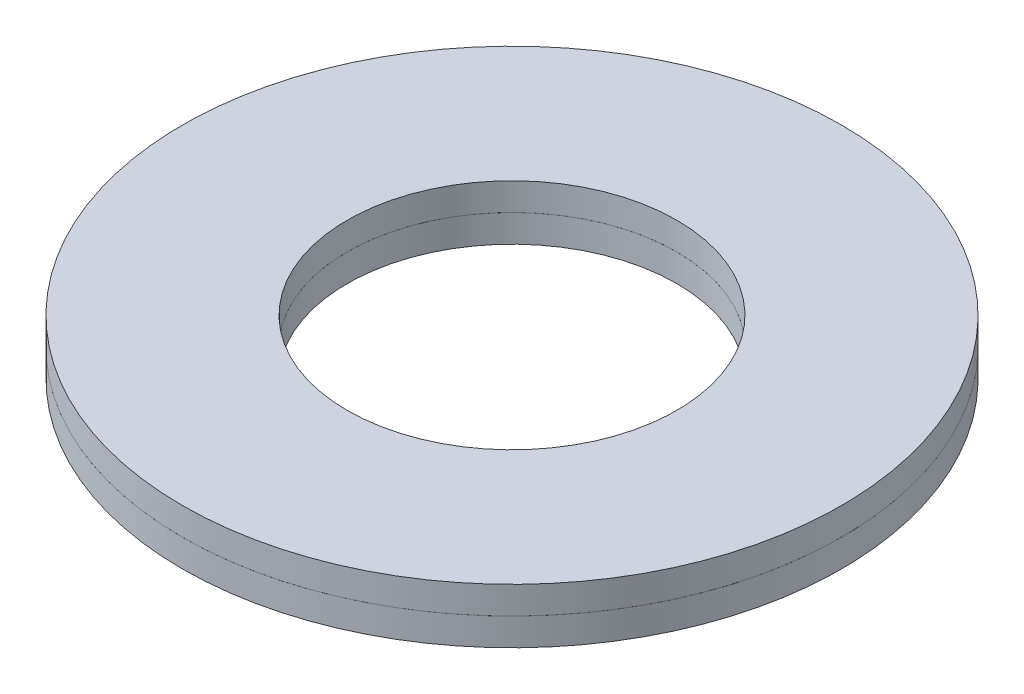
ISO-10303-21;
HEADER;
FILE_DESCRIPTION(('STEP AP214'),'2;1');
FILE_NAME('part.step','',(''),(''),'','','');
FILE_SCHEMA(('AUTOMOTIVE_DESIGN { 1 0 10303 214 1 1 1 1 }'));
ENDSEC;
DATA;
#1=APPLICATION_CONTEXT('core data for automotive mechanical design processes');
#2=APPLICATION_PROTOCOL_DEFINITION('international standard','automotive_design',2000,#1);
#3=PRODUCT_CONTEXT('',#1,'mechanical');
#4=PRODUCT('Part','Part','',(#3));
#5=PRODUCT_RELATED_PRODUCT_CATEGORY('part','',(#4));
#6=PRODUCT_DEFINITION_FORMATION('','',#4);
#7=PRODUCT_DEFINITION_CONTEXT('part definition',#1,'design');
#8=PRODUCT_DEFINITION('design','',#6,#7);
#9=PRODUCT_DEFINITION_SHAPE('','',#8);
#10=(LENGTH_UNIT() NAMED_UNIT(*) SI_UNIT(.MILLI.,.METRE.));
#11=(NAMED_UNIT(*) PLANE_ANGLE_UNIT() SI_UNIT($,.RADIAN.));
#12=(NAMED_UNIT(*) SI_UNIT($,.STERADIAN.) SOLID_ANGLE_UNIT());
#13=UNCERTAINTY_MEASURE_WITH_UNIT(LENGTH_MEASURE(1.E-05),#10,'distance_accuracy_value','');
#14=(GEOMETRIC_REPRESENTATION_CONTEXT(3) GLOBAL_UNCERTAINTY_ASSIGNED_CONTEXT((#13)) GLOBAL_UNIT_ASSIGNED_CONTEXT((#10,
#11,#12)) REPRESENTATION_CONTEXT('',''));
#15=CARTESIAN_POINT('',(0.,0.,0.));
#16=DIRECTION('',(0.,0.,1.));
#17=DIRECTION('',(1.,0.,0.));
#18=AXIS2_PLACEMENT_3D('',#15,#16,#17);
#19=CARTESIAN_POINT('',(0.,64.8981146186238,0.));
#20=DIRECTION('',(0.,1.,0.));
#21=DIRECTION('',(0.,0.,1.));
#22=AXIS2_PLACEMENT_3D('',#19,#20,#21);
#23=CYLINDRICAL_SURFACE('',#22,120.);
#24=CARTESIAN_POINT('',(0.,-10.005,0.));
#25=DIRECTION('',(0.,1.,0.));
#26=DIRECTION('',(0.,0.,1.));
#27=AXIS2_PLACEMENT_3D('',#24,#25,#26);
#28=CIRCLE('',#27,120.);
#29=CARTESIAN_POINT('',(0.,-10.005,120.));
#30=VERTEX_POINT('',#29);
#31=EDGE_CURVE('E11',#30,#30,#28,.T.);
#32=ORIENTED_EDGE('',*,*,#31,.T.);
#33=EDGE_LOOP('',(#32));
#34=FACE_BOUND('',#33,.T.);
#35=CARTESIAN_POINT('',(0.,-0.00499999999999112,0.));
#36=DIRECTION('',(0.,1.,0.));
#37=DIRECTION('',(0.,0.,1.));
#38=AXIS2_PLACEMENT_3D('',#35,#36,#37);
#39=CIRCLE('',#38,120.);
#40=CARTESIAN_POINT('',(0.,-0.00499999999999112,120.));
#41=VERTEX_POINT('',#40);
#42=EDGE_CURVE('E55',#41,#41,#39,.T.);
#43=ORIENTED_EDGE('',*,*,#42,.F.);
#44=EDGE_LOOP('',(#43));
#45=FACE_BOUND('',#44,.T.);
#46=ADVANCED_FACE('F41',(#34,#45),#23,.T.);
#47=CARTESIAN_POINT('',(0.,-10.005,120.));
#48=DIRECTION('',(0.,-1.,0.));
#49=DIRECTION('',(0.,0.,-1.));
#50=AXIS2_PLACEMENT_3D('',#47,#48,#49);
#51=PLANE('',#50);
#52=CARTESIAN_POINT('',(0.,-10.005,0.));
#53=DIRECTION('',(0.,1.,0.));
#54=DIRECTION('',(0.,0.,1.));
#55=AXIS2_PLACEMENT_3D('',#52,#53,#54);
#56=CIRCLE('',#55,60.);
#57=CARTESIAN_POINT('',(0.,-10.005,60.));
#58=VERTEX_POINT('',#57);
#59=EDGE_CURVE('E47',#58,#58,#56,.T.);
#60=ORIENTED_EDGE('',*,*,#59,.T.);
#61=EDGE_LOOP('',(#60));
#62=FACE_BOUND('',#61,.T.);
#63=ORIENTED_EDGE('',*,*,#31,.F.);
#64=EDGE_LOOP('',(#63));
#65=FACE_BOUND('',#64,.T.);
#66=ADVANCED_FACE('F65',(#62,#65),#51,.T.);
#67=CARTESIAN_POINT('',(0.,64.8981146186238,0.));
#68=DIRECTION('',(0.,1.,0.));
#69=DIRECTION('',(0.,0.,1.));
#70=AXIS2_PLACEMENT_3D('',#67,#68,#69);
#71=CYLINDRICAL_SURFACE('',#70,60.);
#72=CARTESIAN_POINT('',(0.,-0.00499999999999112,0.));
#73=DIRECTION('',(0.,1.,0.));
#74=DIRECTION('',(0.,0.,1.));
#75=AXIS2_PLACEMENT_3D('',#72,#73,#74);
#76=CIRCLE('',#75,60.);
#77=CARTESIAN_POINT('',(0.,-0.00499999999999112,60.));
#78=VERTEX_POINT('',#77);
#79=EDGE_CURVE('E51',#78,#78,#76,.T.);
#80=ORIENTED_EDGE('',*,*,#79,.T.);
#81=EDGE_LOOP('',(#80));
#82=FACE_BOUND('',#81,.T.);
#83=ORIENTED_EDGE('',*,*,#59,.F.);
#84=EDGE_LOOP('',(#83));
#85=FACE_BOUND('',#84,.T.);
#86=ADVANCED_FACE('F69',(#82,#85),#71,.F.);
#87=CARTESIAN_POINT('',(0.,-0.00499999999999281,120.));
#88=DIRECTION('',(0.,1.,0.));
#89=DIRECTION('',(0.,0.,1.));
#90=AXIS2_PLACEMENT_3D('',#87,#88,#89);
#91=PLANE('',#90);
#92=ORIENTED_EDGE('',*,*,#42,.T.);
#93=EDGE_LOOP('',(#92));
#94=FACE_BOUND('',#93,.T.);
#95=ORIENTED_EDGE('',*,*,#79,.F.);
#96=EDGE_LOOP('',(#95));
#97=FACE_BOUND('',#96,.T.);
#98=ADVANCED_FACE('F61',(#94,#97),#91,.T.);
#99=CLOSED_SHELL('',(#46,#66,#86,#98));
#100=MANIFOLD_SOLID_BREP('B2',#99);
#101=CARTESIAN_POINT('',(0.,10.005,120.));
#102=DIRECTION('',(0.,1.,0.));
#103=DIRECTION('',(0.,0.,1.));
#104=AXIS2_PLACEMENT_3D('',#101,#102,#103);
#105=PLANE('',#104);
#106=CARTESIAN_POINT('',(0.,10.005,0.));
#107=DIRECTION('',(0.,1.,0.));
#108=DIRECTION('',(0.,0.,1.));
#109=AXIS2_PLACEMENT_3D('',#106,#107,#108);
#110=CIRCLE('',#109,120.);
#111=CARTESIAN_POINT('',(0.,10.005,120.));
#112=VERTEX_POINT('',#111);
#113=EDGE_CURVE('E117',#112,#112,#110,.T.);
#114=ORIENTED_EDGE('',*,*,#113,.T.);
#115=EDGE_LOOP('',(#114));
#116=FACE_BOUND('',#115,.T.);
#117=CARTESIAN_POINT('',(0.,10.005,0.));
#118=DIRECTION('',(0.,1.,0.));
#119=DIRECTION('',(0.,0.,1.));
#120=AXIS2_PLACEMENT_3D('',#117,#118,#119);
#121=CIRCLE('',#120,60.);
#122=CARTESIAN_POINT('',(0.,10.005,60.));
#123=VERTEX_POINT('',#122);
#124=EDGE_CURVE('E40',#123,#123,#121,.T.);
#125=ORIENTED_EDGE('',*,*,#124,.F.);
#126=EDGE_LOOP('',(#125));
#127=FACE_BOUND('',#126,.T.);
#128=ADVANCED_FACE('F103',(#116,#127),#105,.T.);
#129=CARTESIAN_POINT('',(0.,64.8981146186238,0.));
#130=DIRECTION('',(0.,1.,0.));
#131=DIRECTION('',(0.,0.,1.));
#132=AXIS2_PLACEMENT_3D('',#129,#130,#131);
#133=CYLINDRICAL_SURFACE('',#132,60.);
#134=ORIENTED_EDGE('',*,*,#124,.T.);
#135=EDGE_LOOP('',(#134));
#136=FACE_BOUND('',#135,.T.);
#137=CARTESIAN_POINT('',(0.,0.00499999999999112,0.));
#138=DIRECTION('',(0.,1.,0.));
#139=DIRECTION('',(0.,0.,1.));
#140=AXIS2_PLACEMENT_3D('',#137,#138,#139);
#141=CIRCLE('',#140,60.);
#142=CARTESIAN_POINT('',(0.,0.00499999999999112,60.));
#143=VERTEX_POINT('',#142);
#144=EDGE_CURVE('E109',#143,#143,#141,.T.);
#145=ORIENTED_EDGE('',*,*,#144,.F.);
#146=EDGE_LOOP('',(#145));
#147=FACE_BOUND('',#146,.T.);
#148=ADVANCED_FACE('F133',(#136,#147),#133,.F.);
#149=CARTESIAN_POINT('',(0.,0.00499999999999281,60.));
#150=DIRECTION('',(0.,-1.,0.));
#151=DIRECTION('',(0.,0.,-1.));
#152=AXIS2_PLACEMENT_3D('',#149,#150,#151);
#153=PLANE('',#152);
#154=ORIENTED_EDGE('',*,*,#144,.T.);
#155=EDGE_LOOP('',(#154));
#156=FACE_BOUND('',#155,.T.);
#157=CARTESIAN_POINT('',(0.,0.00499999999999112,0.));
#158=DIRECTION('',(0.,1.,0.));
#159=DIRECTION('',(0.,0.,1.));
#160=AXIS2_PLACEMENT_3D('',#157,#158,#159);
#161=CIRCLE('',#160,120.);
#162=CARTESIAN_POINT('',(0.,0.00499999999999112,120.));
#163=VERTEX_POINT('',#162);
#164=EDGE_CURVE('E113',#163,#163,#161,.T.);
#165=ORIENTED_EDGE('',*,*,#164,.F.);
#166=EDGE_LOOP('',(#165));
#167=FACE_BOUND('',#166,.T.);
#168=ADVANCED_FACE('F127',(#156,#167),#153,.T.);
#169=CARTESIAN_POINT('',(0.,64.8981146186238,0.));
#170=DIRECTION('',(0.,1.,0.));
#171=DIRECTION('',(0.,0.,1.));
#172=AXIS2_PLACEMENT_3D('',#169,#170,#171);
#173=CYLINDRICAL_SURFACE('',#172,120.);
#174=ORIENTED_EDGE('',*,*,#164,.T.);
#175=EDGE_LOOP('',(#174));
#176=FACE_BOUND('',#175,.T.);
#177=ORIENTED_EDGE('',*,*,#113,.F.);
#178=EDGE_LOOP('',(#177));
#179=FACE_BOUND('',#178,.T.);
#180=ADVANCED_FACE('F125',(#176,#179),#173,.T.);
#181=CLOSED_SHELL('',(#128,#148,#168,#180));
#182=MANIFOLD_SOLID_BREP('B6',#181);
#183=ADVANCED_BREP_SHAPE_REPRESENTATION('',(#18,#100,#182),#14);
#184=SHAPE_DEFINITION_REPRESENTATION(#9,#183);
ENDSEC;
END-ISO-10303-21;
